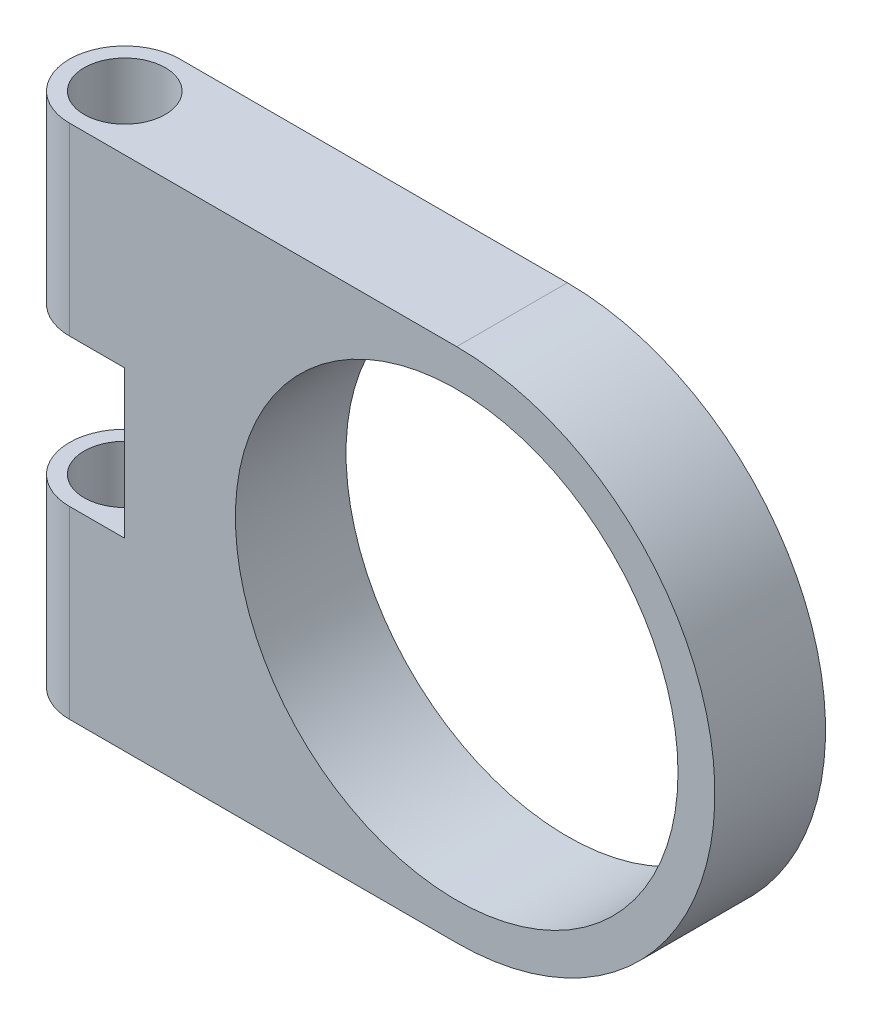
ISO-10303-21;
HEADER;
FILE_DESCRIPTION(('STEP AP214'),'2;1');
FILE_NAME('part.step','',(''),(''),'','','');
FILE_SCHEMA(('AUTOMOTIVE_DESIGN { 1 0 10303 214 1 1 1 1 }'));
ENDSEC;
DATA;
#1=APPLICATION_CONTEXT('core data for automotive mechanical design processes');
#2=APPLICATION_PROTOCOL_DEFINITION('international standard','automotive_design',2000,#1);
#3=PRODUCT_CONTEXT('',#1,'mechanical');
#4=PRODUCT('Part','Part','',(#3));
#5=PRODUCT_RELATED_PRODUCT_CATEGORY('part','',(#4));
#6=PRODUCT_DEFINITION_FORMATION('','',#4);
#7=PRODUCT_DEFINITION_CONTEXT('part definition',#1,'design');
#8=PRODUCT_DEFINITION('design','',#6,#7);
#9=PRODUCT_DEFINITION_SHAPE('','',#8);
#10=(LENGTH_UNIT() NAMED_UNIT(*) SI_UNIT(.MILLI.,.METRE.));
#11=(NAMED_UNIT(*) PLANE_ANGLE_UNIT() SI_UNIT($,.RADIAN.));
#12=(NAMED_UNIT(*) SI_UNIT($,.STERADIAN.) SOLID_ANGLE_UNIT());
#13=UNCERTAINTY_MEASURE_WITH_UNIT(LENGTH_MEASURE(1.E-05),#10,'distance_accuracy_value','');
#14=(GEOMETRIC_REPRESENTATION_CONTEXT(3) GLOBAL_UNCERTAINTY_ASSIGNED_CONTEXT((#13)) GLOBAL_UNIT_ASSIGNED_CONTEXT((#10,
#11,#12)) REPRESENTATION_CONTEXT('',''));
#15=CARTESIAN_POINT('',(0.,0.,0.));
#16=DIRECTION('',(0.,0.,1.));
#17=DIRECTION('',(1.,0.,0.));
#18=AXIS2_PLACEMENT_3D('',#15,#16,#17);
#19=CARTESIAN_POINT('',(-52.5,-35.,-7.5));
#20=DIRECTION('',(0.,-1.,0.));
#21=DIRECTION('',(1.,0.,0.));
#22=AXIS2_PLACEMENT_3D('',#19,#20,#21);
#23=CYLINDRICAL_SURFACE('',#22,7.5);
#24=DIRECTION('',(0.,1.,0.));
#25=VECTOR('',#24,1.);
#26=CARTESIAN_POINT('',(-52.5,-35.,-15.));
#27=LINE('',#26,#25);
#28=CARTESIAN_POINT('',(-52.5,-35.,-15.));
#29=VERTEX_POINT('',#28);
#30=CARTESIAN_POINT('',(-52.5,-10.,-15.));
#31=VERTEX_POINT('',#30);
#32=EDGE_CURVE('E173',#29,#31,#27,.T.);
#33=ORIENTED_EDGE('',*,*,#32,.F.);
#34=CARTESIAN_POINT('',(-52.5,-35.,-7.5));
#35=DIRECTION('',(0.,-1.,0.));
#36=DIRECTION('',(1.,0.,0.));
#37=AXIS2_PLACEMENT_3D('',#34,#35,#36);
#38=CIRCLE('',#37,7.5);
#39=CARTESIAN_POINT('',(-52.5,-35.,0.));
#40=VERTEX_POINT('',#39);
#41=EDGE_CURVE('E42',#40,#29,#38,.T.);
#42=ORIENTED_EDGE('',*,*,#41,.F.);
#43=DIRECTION('',(0.,-1.,0.));
#44=VECTOR('',#43,1.);
#45=CARTESIAN_POINT('',(-52.5,0.,0.));
#46=LINE('',#45,#44);
#47=CARTESIAN_POINT('',(-52.5,-10.,0.));
#48=VERTEX_POINT('',#47);
#49=EDGE_CURVE('E176',#48,#40,#46,.T.);
#50=ORIENTED_EDGE('',*,*,#49,.F.);
#51=CARTESIAN_POINT('',(-52.5,-10.,-7.5));
#52=DIRECTION('',(0.,1.,0.));
#53=DIRECTION('',(0.,0.,1.));
#54=AXIS2_PLACEMENT_3D('',#51,#52,#53);
#55=CIRCLE('',#54,7.5);
#56=EDGE_CURVE('E11',#31,#48,#55,.T.);
#57=ORIENTED_EDGE('',*,*,#56,.F.);
#58=EDGE_LOOP('',(#33,#42,#50,#57));
#59=FACE_BOUND('',#58,.T.);
#60=ADVANCED_FACE('F34',(#59),#23,.T.);
#61=CARTESIAN_POINT('',(-52.5,35.,-7.5));
#62=DIRECTION('',(0.,-1.,0.));
#63=DIRECTION('',(1.,0.,0.));
#64=AXIS2_PLACEMENT_3D('',#61,#62,#63);
#65=CYLINDRICAL_SURFACE('',#64,7.5);
#66=DIRECTION('',(0.,-1.,0.));
#67=VECTOR('',#66,1.);
#68=CARTESIAN_POINT('',(-52.5,0.,0.));
#69=LINE('',#68,#67);
#70=CARTESIAN_POINT('',(-52.5,35.,0.));
#71=VERTEX_POINT('',#70);
#72=CARTESIAN_POINT('',(-52.5,10.,0.));
#73=VERTEX_POINT('',#72);
#74=EDGE_CURVE('E159',#71,#73,#69,.T.);
#75=ORIENTED_EDGE('',*,*,#74,.F.);
#76=CARTESIAN_POINT('',(-52.5,35.,-7.5));
#77=DIRECTION('',(0.,1.,0.));
#78=DIRECTION('',(-1.,0.,0.));
#79=AXIS2_PLACEMENT_3D('',#76,#77,#78);
#80=CIRCLE('',#79,7.5);
#81=CARTESIAN_POINT('',(-52.5,35.,-15.));
#82=VERTEX_POINT('',#81);
#83=EDGE_CURVE('E171',#82,#71,#80,.T.);
#84=ORIENTED_EDGE('',*,*,#83,.F.);
#85=DIRECTION('',(0.,1.,0.));
#86=VECTOR('',#85,1.);
#87=CARTESIAN_POINT('',(-52.5,35.,-15.));
#88=LINE('',#87,#86);
#89=CARTESIAN_POINT('',(-52.5,10.,-15.));
#90=VERTEX_POINT('',#89);
#91=EDGE_CURVE('E168',#90,#82,#88,.T.);
#92=ORIENTED_EDGE('',*,*,#91,.F.);
#93=CARTESIAN_POINT('',(-52.5,10.,-7.5));
#94=DIRECTION('',(0.,1.,0.));
#95=DIRECTION('',(0.,0.,1.));
#96=AXIS2_PLACEMENT_3D('',#93,#94,#95);
#97=CIRCLE('',#96,7.5);
#98=EDGE_CURVE('E165',#73,#90,#97,.F.);
#99=ORIENTED_EDGE('',*,*,#98,.F.);
#100=EDGE_LOOP('',(#75,#84,#92,#99));
#101=FACE_BOUND('',#100,.T.);
#102=ADVANCED_FACE('F194',(#101),#65,.T.);
#103=CARTESIAN_POINT('',(-52.5,-50.556349186104,-7.5));
#104=DIRECTION('',(0.,1.,0.));
#105=DIRECTION('',(-1.,0.,0.));
#106=AXIS2_PLACEMENT_3D('',#103,#104,#105);
#107=CYLINDRICAL_SURFACE('',#106,5.5);
#108=CARTESIAN_POINT('',(-52.5,-35.,-7.5));
#109=DIRECTION('',(0.,-1.,0.));
#110=DIRECTION('',(1.,0.,0.));
#111=AXIS2_PLACEMENT_3D('',#108,#109,#110);
#112=CIRCLE('',#111,5.5);
#113=CARTESIAN_POINT('',(-58.,-35.,-7.5));
#114=VERTEX_POINT('',#113);
#115=EDGE_CURVE('E131',#114,#114,#112,.F.);
#116=CARTESIAN_POINT('',(-52.5,-10.,-7.5));
#117=DIRECTION('',(0.,1.,0.));
#118=DIRECTION('',(0.,0.,1.));
#119=AXIS2_PLACEMENT_3D('',#116,#117,#118);
#120=CIRCLE('',#119,5.5);
#121=CARTESIAN_POINT('',(-58.,-10.,-7.5));
#122=VERTEX_POINT('',#121);
#123=EDGE_CURVE('E119',#122,#122,#120,.F.);
#124=CARTESIAN_POINT('',(-58.,-35.,-7.5));
#125=CARTESIAN_POINT('',(-58.,-34.7395833333333,-7.5));
#126=CARTESIAN_POINT('',(-58.,-34.4791666666667,-7.5));
#127=CARTESIAN_POINT('',(-58.,-33.9583333333333,-7.5));
#128=CARTESIAN_POINT('',(-58.,-33.6979166666667,-7.5));
#129=CARTESIAN_POINT('',(-58.,-33.1770833333333,-7.5));
#130=CARTESIAN_POINT('',(-58.,-32.9166666666667,-7.5));
#131=CARTESIAN_POINT('',(-58.,-32.3958333333333,-7.5));
#132=CARTESIAN_POINT('',(-58.,-32.1354166666667,-7.5));
#133=CARTESIAN_POINT('',(-58.,-31.6145833333333,-7.5));
#134=CARTESIAN_POINT('',(-58.,-31.3541666666667,-7.5));
#135=CARTESIAN_POINT('',(-58.,-30.8333333333333,-7.5));
#136=CARTESIAN_POINT('',(-58.,-30.5729166666667,-7.5));
#137=CARTESIAN_POINT('',(-58.,-30.0520833333333,-7.5));
#138=CARTESIAN_POINT('',(-58.,-29.7916666666667,-7.5));
#139=CARTESIAN_POINT('',(-58.,-29.2708333333333,-7.5));
#140=CARTESIAN_POINT('',(-58.,-29.0104166666667,-7.5));
#141=CARTESIAN_POINT('',(-58.,-28.4895833333333,-7.5));
#142=CARTESIAN_POINT('',(-58.,-28.2291666666667,-7.5));
#143=CARTESIAN_POINT('',(-58.,-27.7083333333333,-7.5));
#144=CARTESIAN_POINT('',(-58.,-27.4479166666667,-7.5));
#145=CARTESIAN_POINT('',(-58.,-26.9270833333333,-7.5));
#146=CARTESIAN_POINT('',(-58.,-26.6666666666667,-7.5));
#147=CARTESIAN_POINT('',(-58.,-26.1458333333333,-7.5));
#148=CARTESIAN_POINT('',(-58.,-25.8854166666667,-7.5));
#149=CARTESIAN_POINT('',(-58.,-25.3645833333333,-7.5));
#150=CARTESIAN_POINT('',(-58.,-25.1041666666667,-7.5));
#151=CARTESIAN_POINT('',(-58.,-24.5833333333333,-7.5));
#152=CARTESIAN_POINT('',(-58.,-24.3229166666667,-7.5));
#153=CARTESIAN_POINT('',(-58.,-23.8020833333333,-7.5));
#154=CARTESIAN_POINT('',(-58.,-23.5416666666667,-7.5));
#155=CARTESIAN_POINT('',(-58.,-23.0208333333333,-7.5));
#156=CARTESIAN_POINT('',(-58.,-22.7604166666667,-7.5));
#157=CARTESIAN_POINT('',(-58.,-22.2395833333333,-7.5));
#158=CARTESIAN_POINT('',(-58.,-21.9791666666667,-7.5));
#159=CARTESIAN_POINT('',(-58.,-21.4583333333333,-7.5));
#160=CARTESIAN_POINT('',(-58.,-21.1979166666667,-7.5));
#161=CARTESIAN_POINT('',(-58.,-20.6770833333333,-7.5));
#162=CARTESIAN_POINT('',(-58.,-20.4166666666667,-7.5));
#163=CARTESIAN_POINT('',(-58.,-19.8958333333333,-7.5));
#164=CARTESIAN_POINT('',(-58.,-19.6354166666667,-7.5));
#165=CARTESIAN_POINT('',(-58.,-19.1145833333333,-7.5));
#166=CARTESIAN_POINT('',(-58.,-18.8541666666667,-7.5));
#167=CARTESIAN_POINT('',(-58.,-18.3333333333333,-7.5));
#168=CARTESIAN_POINT('',(-58.,-18.0729166666667,-7.5));
#169=CARTESIAN_POINT('',(-58.,-17.5520833333333,-7.5));
#170=CARTESIAN_POINT('',(-58.,-17.2916666666667,-7.5));
#171=CARTESIAN_POINT('',(-58.,-16.7708333333333,-7.5));
#172=CARTESIAN_POINT('',(-58.,-16.5104166666667,-7.5));
#173=CARTESIAN_POINT('',(-58.,-15.9895833333333,-7.5));
#174=CARTESIAN_POINT('',(-58.,-15.7291666666667,-7.5));
#175=CARTESIAN_POINT('',(-58.,-15.2083333333333,-7.5));
#176=CARTESIAN_POINT('',(-58.,-14.9479166666667,-7.5));
#177=CARTESIAN_POINT('',(-58.,-14.4270833333333,-7.5));
#178=CARTESIAN_POINT('',(-58.,-14.1666666666667,-7.5));
#179=CARTESIAN_POINT('',(-58.,-13.6458333333333,-7.5));
#180=CARTESIAN_POINT('',(-58.,-13.3854166666667,-7.5));
#181=CARTESIAN_POINT('',(-58.,-12.8645833333333,-7.5));
#182=CARTESIAN_POINT('',(-58.,-12.6041666666667,-7.5));
#183=CARTESIAN_POINT('',(-58.,-12.0833333333333,-7.5));
#184=CARTESIAN_POINT('',(-58.,-11.8229166666667,-7.5));
#185=CARTESIAN_POINT('',(-58.,-11.3020833333333,-7.5));
#186=CARTESIAN_POINT('',(-58.,-11.0416666666667,-7.5));
#187=CARTESIAN_POINT('',(-58.,-10.5208333333333,-7.5));
#188=CARTESIAN_POINT('',(-58.,-10.2604166666667,-7.5));
#189=CARTESIAN_POINT('',(-58.,-10.,-7.5));
#190=B_SPLINE_CURVE_WITH_KNOTS('',3,(#124,#125,#126,#127,#128,#129,#130,#131,#132,#133,#134,
#135,#136,#137,#138,#139,#140,#141,#142,#143,#144,#145,#146,#147,#148,#149,#150,#151,#152,#153,
#154,#155,#156,#157,#158,#159,#160,#161,#162,#163,#164,#165,#166,#167,#168,#169,#170,#171,#172,
#173,#174,#175,#176,#177,#178,#179,#180,#181,#182,#183,#184,#185,#186,#187,#188,#189),
.UNSPECIFIED.,.F.,.F.,(4,2,2,2,2,2,2,2,2,2,2,2,2,2,2,2,2,2,2,2,2,2,2,2,2,2,2,2,2,2,2,2,4),(0.,
0.781250000000004,1.5625,2.34375,3.125,3.90625,4.6875,5.46875,6.25,7.03125,7.8125,8.59375,9.375,
10.15625,10.9375,11.71875,12.5,13.28125,14.0625,14.84375,15.625,16.40625,17.1875,17.96875,18.75,
19.53125,20.3125,21.09375,21.875,22.65625,23.4375,24.21875,25.),.UNSPECIFIED.);
#191=EDGE_CURVE('BSEAM212',#114,#122,#190,.T.);
#192=ORIENTED_EDGE('',*,*,#115,.F.);
#193=ORIENTED_EDGE('',*,*,#123,.F.);
#194=ORIENTED_EDGE('',*,*,#191,.T.);
#195=ORIENTED_EDGE('',*,*,#191,.F.);
#196=EDGE_LOOP('',(#192,#194,#193,#195));
#197=FACE_BOUND('',#196,.T.);
#198=ADVANCED_FACE('F212',(#197),#107,.F.);
#199=CARTESIAN_POINT('',(-60.,35.,-15.));
#200=DIRECTION('',(0.,1.,0.));
#201=DIRECTION('',(-1.,0.,0.));
#202=AXIS2_PLACEMENT_3D('',#199,#200,#201);
#203=PLANE('',#202);
#204=CARTESIAN_POINT('',(-52.5,35.,-7.5));
#205=DIRECTION('',(0.,1.,0.));
#206=DIRECTION('',(-1.,0.,0.));
#207=AXIS2_PLACEMENT_3D('',#204,#205,#206);
#208=CIRCLE('',#207,5.5);
#209=CARTESIAN_POINT('',(-58.,35.,-7.5));
#210=VERTEX_POINT('',#209);
#211=EDGE_CURVE('E128',#210,#210,#208,.T.);
#212=ORIENTED_EDGE('',*,*,#211,.F.);
#213=EDGE_LOOP('',(#212));
#214=FACE_BOUND('',#213,.T.);
#215=DIRECTION('',(-1.,0.,0.));
#216=VECTOR('',#215,1.);
#217=CARTESIAN_POINT('',(-60.,35.,-15.));
#218=LINE('',#217,#216);
#219=CARTESIAN_POINT('',(0.,35.,-15.));
#220=VERTEX_POINT('',#219);
#221=EDGE_CURVE('E147',#220,#82,#218,.T.);
#222=ORIENTED_EDGE('',*,*,#221,.T.);
#223=ORIENTED_EDGE('',*,*,#83,.T.);
#224=DIRECTION('',(-1.,0.,0.));
#225=VECTOR('',#224,1.);
#226=CARTESIAN_POINT('',(-60.,35.,0.));
#227=LINE('',#226,#225);
#228=CARTESIAN_POINT('',(0.,35.,0.));
#229=VERTEX_POINT('',#228);
#230=EDGE_CURVE('E144',#229,#71,#227,.T.);
#231=ORIENTED_EDGE('',*,*,#230,.F.);
#232=DIRECTION('',(0.,0.,1.));
#233=VECTOR('',#232,1.);
#234=CARTESIAN_POINT('',(0.,35.,-15.));
#235=LINE('',#234,#233);
#236=EDGE_CURVE('E157',#220,#229,#235,.T.);
#237=ORIENTED_EDGE('',*,*,#236,.F.);
#238=EDGE_LOOP('',(#222,#223,#231,#237));
#239=FACE_BOUND('',#238,.T.);
#240=ADVANCED_FACE('F191',(#214,#239),#203,.T.);
#241=CARTESIAN_POINT('',(0.,0.,-15.));
#242=DIRECTION('',(0.,0.,1.));
#243=DIRECTION('',(1.,0.,0.));
#244=AXIS2_PLACEMENT_3D('',#241,#242,#243);
#245=CYLINDRICAL_SURFACE('',#244,35.);
#246=CARTESIAN_POINT('',(0.,0.,0.));
#247=DIRECTION('',(0.,0.,1.));
#248=DIRECTION('',(1.,0.,0.));
#249=AXIS2_PLACEMENT_3D('',#246,#247,#248);
#250=CIRCLE('',#249,35.);
#251=CARTESIAN_POINT('',(0.,-35.,0.));
#252=VERTEX_POINT('',#251);
#253=EDGE_CURVE('E152',#252,#229,#250,.T.);
#254=ORIENTED_EDGE('',*,*,#253,.F.);
#255=DIRECTION('',(0.,0.,1.));
#256=VECTOR('',#255,1.);
#257=CARTESIAN_POINT('',(0.,-35.,-15.));
#258=LINE('',#257,#256);
#259=CARTESIAN_POINT('',(0.,-35.,-15.));
#260=VERTEX_POINT('',#259);
#261=EDGE_CURVE('E150',#260,#252,#258,.T.);
#262=ORIENTED_EDGE('',*,*,#261,.F.);
#263=CARTESIAN_POINT('',(0.,0.,-15.));
#264=DIRECTION('',(0.,0.,1.));
#265=DIRECTION('',(1.,0.,0.));
#266=AXIS2_PLACEMENT_3D('',#263,#264,#265);
#267=CIRCLE('',#266,35.);
#268=EDGE_CURVE('E143',#260,#220,#267,.T.);
#269=ORIENTED_EDGE('',*,*,#268,.T.);
#270=ORIENTED_EDGE('',*,*,#236,.T.);
#271=EDGE_LOOP('',(#254,#262,#269,#270));
#272=FACE_BOUND('',#271,.T.);
#273=ADVANCED_FACE('F188',(#272),#245,.T.);
#274=CARTESIAN_POINT('',(-60.,-35.,-15.));
#275=DIRECTION('',(0.,-1.,0.));
#276=DIRECTION('',(1.,0.,0.));
#277=AXIS2_PLACEMENT_3D('',#274,#275,#276);
#278=PLANE('',#277);
#279=ORIENTED_EDGE('',*,*,#115,.T.);
#280=EDGE_LOOP('',(#279));
#281=FACE_BOUND('',#280,.T.);
#282=DIRECTION('',(1.,0.,0.));
#283=VECTOR('',#282,1.);
#284=CARTESIAN_POINT('',(-60.,-35.,0.));
#285=LINE('',#284,#283);
#286=EDGE_CURVE('E138',#40,#252,#285,.T.);
#287=ORIENTED_EDGE('',*,*,#286,.F.);
#288=ORIENTED_EDGE('',*,*,#41,.T.);
#289=DIRECTION('',(1.,0.,0.));
#290=VECTOR('',#289,1.);
#291=CARTESIAN_POINT('',(-60.,-35.,-15.));
#292=LINE('',#291,#290);
#293=EDGE_CURVE('E141',#29,#260,#292,.T.);
#294=ORIENTED_EDGE('',*,*,#293,.T.);
#295=ORIENTED_EDGE('',*,*,#261,.T.);
#296=EDGE_LOOP('',(#287,#288,#294,#295));
#297=FACE_BOUND('',#296,.T.);
#298=ADVANCED_FACE('F179',(#281,#297),#278,.T.);
#299=CARTESIAN_POINT('',(0.,0.,-15.));
#300=DIRECTION('',(0.,0.,1.));
#301=DIRECTION('',(1.,0.,0.));
#302=AXIS2_PLACEMENT_3D('',#299,#300,#301);
#303=PLANE('',#302);
#304=CARTESIAN_POINT('',(0.,0.,-15.));
#305=DIRECTION('',(0.,0.,1.));
#306=DIRECTION('',(1.,0.,0.));
#307=AXIS2_PLACEMENT_3D('',#304,#305,#306);
#308=CIRCLE('',#307,30.);
#309=CARTESIAN_POINT('',(30.,0.,-15.));
#310=VERTEX_POINT('',#309);
#311=EDGE_CURVE('E135',#310,#310,#308,.T.);
#312=ORIENTED_EDGE('',*,*,#311,.T.);
#313=EDGE_LOOP('',(#312));
#314=FACE_BOUND('',#313,.T.);
#315=ORIENTED_EDGE('',*,*,#293,.F.);
#316=ORIENTED_EDGE('',*,*,#32,.T.);
#317=DIRECTION('',(-1.,0.,0.));
#318=VECTOR('',#317,1.);
#319=CARTESIAN_POINT('',(-60.,-10.,-15.));
#320=LINE('',#319,#318);
#321=CARTESIAN_POINT('',(-45.,-10.,-15.));
#322=VERTEX_POINT('',#321);
#323=EDGE_CURVE('E103',#322,#31,#320,.T.);
#324=ORIENTED_EDGE('',*,*,#323,.F.);
#325=DIRECTION('',(0.,-1.,0.));
#326=VECTOR('',#325,1.);
#327=CARTESIAN_POINT('',(-45.,10.,-15.));
#328=LINE('',#327,#326);
#329=CARTESIAN_POINT('',(-45.,10.,-15.));
#330=VERTEX_POINT('',#329);
#331=EDGE_CURVE('E111',#330,#322,#328,.T.);
#332=ORIENTED_EDGE('',*,*,#331,.F.);
#333=DIRECTION('',(-1.,0.,0.));
#334=VECTOR('',#333,1.);
#335=CARTESIAN_POINT('',(-60.,10.,-15.));
#336=LINE('',#335,#334);
#337=EDGE_CURVE('E112',#330,#90,#336,.T.);
#338=ORIENTED_EDGE('',*,*,#337,.T.);
#339=ORIENTED_EDGE('',*,*,#91,.T.);
#340=ORIENTED_EDGE('',*,*,#221,.F.);
#341=ORIENTED_EDGE('',*,*,#268,.F.);
#342=EDGE_LOOP('',(#315,#316,#324,#332,#338,#339,#340,#341));
#343=FACE_BOUND('',#342,.T.);
#344=ADVANCED_FACE('F184',(#314,#343),#303,.F.);
#345=CARTESIAN_POINT('',(0.,0.,0.));
#346=DIRECTION('',(0.,0.,1.));
#347=DIRECTION('',(1.,0.,0.));
#348=AXIS2_PLACEMENT_3D('',#345,#346,#347);
#349=PLANE('',#348);
#350=DIRECTION('',(1.,0.,0.));
#351=VECTOR('',#350,1.);
#352=CARTESIAN_POINT('',(-45.,-10.,0.));
#353=LINE('',#352,#351);
#354=CARTESIAN_POINT('',(-45.,-10.,0.));
#355=VERTEX_POINT('',#354);
#356=EDGE_CURVE('E95',#48,#355,#353,.T.);
#357=ORIENTED_EDGE('',*,*,#356,.F.);
#358=ORIENTED_EDGE('',*,*,#49,.T.);
#359=ORIENTED_EDGE('',*,*,#286,.T.);
#360=ORIENTED_EDGE('',*,*,#253,.T.);
#361=ORIENTED_EDGE('',*,*,#230,.T.);
#362=ORIENTED_EDGE('',*,*,#74,.T.);
#363=DIRECTION('',(1.,0.,0.));
#364=VECTOR('',#363,1.);
#365=CARTESIAN_POINT('',(-45.,10.,0.));
#366=LINE('',#365,#364);
#367=CARTESIAN_POINT('',(-45.,10.,0.));
#368=VERTEX_POINT('',#367);
#369=EDGE_CURVE('E118',#73,#368,#366,.T.);
#370=ORIENTED_EDGE('',*,*,#369,.T.);
#371=DIRECTION('',(0.,-1.,0.));
#372=VECTOR('',#371,1.);
#373=CARTESIAN_POINT('',(-45.,10.,0.));
#374=LINE('',#373,#372);
#375=EDGE_CURVE('E108',#368,#355,#374,.T.);
#376=ORIENTED_EDGE('',*,*,#375,.T.);
#377=EDGE_LOOP('',(#357,#358,#359,#360,#361,#362,#370,#376));
#378=FACE_BOUND('',#377,.T.);
#379=CARTESIAN_POINT('',(0.,0.,0.));
#380=DIRECTION('',(0.,0.,1.));
#381=DIRECTION('',(1.,0.,0.));
#382=AXIS2_PLACEMENT_3D('',#379,#380,#381);
#383=CIRCLE('',#382,30.);
#384=CARTESIAN_POINT('',(30.,0.,0.));
#385=VERTEX_POINT('',#384);
#386=EDGE_CURVE('E134',#385,#385,#383,.T.);
#387=ORIENTED_EDGE('',*,*,#386,.F.);
#388=EDGE_LOOP('',(#387));
#389=FACE_BOUND('',#388,.T.);
#390=ADVANCED_FACE('F114',(#378,#389),#349,.T.);
#391=CARTESIAN_POINT('',(0.,0.,-15.));
#392=DIRECTION('',(0.,0.,1.));
#393=DIRECTION('',(1.,0.,0.));
#394=AXIS2_PLACEMENT_3D('',#391,#392,#393);
#395=CYLINDRICAL_SURFACE('',#394,30.);
#396=ORIENTED_EDGE('',*,*,#311,.F.);
#397=EDGE_LOOP('',(#396));
#398=FACE_BOUND('',#397,.T.);
#399=ORIENTED_EDGE('',*,*,#386,.T.);
#400=EDGE_LOOP('',(#399));
#401=FACE_BOUND('',#400,.T.);
#402=ADVANCED_FACE('F210',(#398,#401),#395,.F.);
#403=CARTESIAN_POINT('',(-52.5,10.,-7.5));
#404=DIRECTION('',(0.,1.,0.));
#405=DIRECTION('',(0.,0.,1.));
#406=AXIS2_PLACEMENT_3D('',#403,#404,#405);
#407=CIRCLE('',#406,5.5);
#408=CARTESIAN_POINT('',(-58.,9.99999999999999,-7.5));
#409=VERTEX_POINT('',#408);
#410=EDGE_CURVE('E122',#409,#409,#407,.F.);
#411=CARTESIAN_POINT('',(-58.,9.99999999999999,-7.5));
#412=CARTESIAN_POINT('',(-58.,10.2604166666667,-7.5));
#413=CARTESIAN_POINT('',(-58.,10.5208333333333,-7.5));
#414=CARTESIAN_POINT('',(-58.,11.0416666666667,-7.5));
#415=CARTESIAN_POINT('',(-58.,11.3020833333333,-7.5));
#416=CARTESIAN_POINT('',(-58.,11.8229166666667,-7.5));
#417=CARTESIAN_POINT('',(-58.,12.0833333333333,-7.5));
#418=CARTESIAN_POINT('',(-58.,12.6041666666667,-7.5));
#419=CARTESIAN_POINT('',(-58.,12.8645833333333,-7.5));
#420=CARTESIAN_POINT('',(-58.,13.3854166666667,-7.5));
#421=CARTESIAN_POINT('',(-58.,13.6458333333333,-7.5));
#422=CARTESIAN_POINT('',(-58.,14.1666666666667,-7.5));
#423=CARTESIAN_POINT('',(-58.,14.4270833333333,-7.5));
#424=CARTESIAN_POINT('',(-58.,14.9479166666667,-7.5));
#425=CARTESIAN_POINT('',(-58.,15.2083333333333,-7.5));
#426=CARTESIAN_POINT('',(-58.,15.7291666666666,-7.5));
#427=CARTESIAN_POINT('',(-58.,15.9895833333333,-7.5));
#428=CARTESIAN_POINT('',(-58.,16.5104166666666,-7.5));
#429=CARTESIAN_POINT('',(-58.,16.7708333333333,-7.5));
#430=CARTESIAN_POINT('',(-58.,17.2916666666666,-7.5));
#431=CARTESIAN_POINT('',(-58.,17.5520833333333,-7.5));
#432=CARTESIAN_POINT('',(-58.,18.0729166666667,-7.5));
#433=CARTESIAN_POINT('',(-58.,18.3333333333333,-7.5));
#434=CARTESIAN_POINT('',(-58.,18.8541666666667,-7.5));
#435=CARTESIAN_POINT('',(-58.,19.1145833333333,-7.5));
#436=CARTESIAN_POINT('',(-58.,19.6354166666666,-7.5));
#437=CARTESIAN_POINT('',(-58.,19.8958333333333,-7.5));
#438=CARTESIAN_POINT('',(-58.,20.4166666666666,-7.5));
#439=CARTESIAN_POINT('',(-58.,20.6770833333333,-7.5));
#440=CARTESIAN_POINT('',(-58.,21.1979166666666,-7.5));
#441=CARTESIAN_POINT('',(-58.,21.4583333333333,-7.5));
#442=CARTESIAN_POINT('',(-58.,21.9791666666666,-7.5));
#443=CARTESIAN_POINT('',(-58.,22.2395833333333,-7.5));
#444=CARTESIAN_POINT('',(-58.,22.7604166666667,-7.5));
#445=CARTESIAN_POINT('',(-58.,23.0208333333333,-7.5));
#446=CARTESIAN_POINT('',(-58.,23.5416666666666,-7.5));
#447=CARTESIAN_POINT('',(-58.,23.8020833333333,-7.5));
#448=CARTESIAN_POINT('',(-58.,24.3229166666666,-7.5));
#449=CARTESIAN_POINT('',(-58.,24.5833333333333,-7.5));
#450=CARTESIAN_POINT('',(-58.,25.1041666666666,-7.5));
#451=CARTESIAN_POINT('',(-58.,25.3645833333333,-7.5));
#452=CARTESIAN_POINT('',(-58.,25.8854166666666,-7.5));
#453=CARTESIAN_POINT('',(-58.,26.1458333333333,-7.5));
#454=CARTESIAN_POINT('',(-58.,26.6666666666666,-7.5));
#455=CARTESIAN_POINT('',(-58.,26.9270833333333,-7.5));
#456=CARTESIAN_POINT('',(-58.,27.4479166666666,-7.5));
#457=CARTESIAN_POINT('',(-58.,27.7083333333333,-7.5));
#458=CARTESIAN_POINT('',(-58.,28.2291666666666,-7.5));
#459=CARTESIAN_POINT('',(-58.,28.4895833333333,-7.5));
#460=CARTESIAN_POINT('',(-58.,29.0104166666666,-7.5));
#461=CARTESIAN_POINT('',(-58.,29.2708333333333,-7.5));
#462=CARTESIAN_POINT('',(-58.,29.7916666666666,-7.5));
#463=CARTESIAN_POINT('',(-58.,30.0520833333333,-7.5));
#464=CARTESIAN_POINT('',(-58.,30.5729166666666,-7.5));
#465=CARTESIAN_POINT('',(-58.,30.8333333333333,-7.5));
#466=CARTESIAN_POINT('',(-58.,31.3541666666666,-7.5));
#467=CARTESIAN_POINT('',(-58.,31.6145833333333,-7.5));
#468=CARTESIAN_POINT('',(-58.,32.1354166666666,-7.5));
#469=CARTESIAN_POINT('',(-58.,32.3958333333333,-7.5));
#470=CARTESIAN_POINT('',(-58.,32.9166666666666,-7.5));
#471=CARTESIAN_POINT('',(-58.,33.1770833333333,-7.5));
#472=CARTESIAN_POINT('',(-58.,33.6979166666666,-7.5));
#473=CARTESIAN_POINT('',(-58.,33.9583333333333,-7.5));
#474=CARTESIAN_POINT('',(-58.,34.4791666666666,-7.5));
#475=CARTESIAN_POINT('',(-58.,34.7395833333333,-7.5));
#476=CARTESIAN_POINT('',(-58.,35.,-7.5));
#477=B_SPLINE_CURVE_WITH_KNOTS('',3,(#411,#412,#413,#414,#415,#416,#417,#418,#419,#420,#421,
#422,#423,#424,#425,#426,#427,#428,#429,#430,#431,#432,#433,#434,#435,#436,#437,#438,#439,#440,
#441,#442,#443,#444,#445,#446,#447,#448,#449,#450,#451,#452,#453,#454,#455,#456,#457,#458,#459,
#460,#461,#462,#463,#464,#465,#466,#467,#468,#469,#470,#471,#472,#473,#474,#475,#476),
.UNSPECIFIED.,.F.,.F.,(4,2,2,2,2,2,2,2,2,2,2,2,2,2,2,2,2,2,2,2,2,2,2,2,2,2,2,2,2,2,2,2,4),(0.,
0.781249999999997,1.5625,2.34374999999998,3.125,3.90624999999999,4.68749999999999,
5.46874999999999,6.24999999999998,7.03124999999998,7.81249999999999,8.59374999999999,
9.37499999999999,10.15625,10.9375,11.71875,12.5,13.28125,14.0625,14.84375,15.625,16.40625,
17.1875,17.96875,18.75,19.53125,20.3125,21.09375,21.875,22.65625,23.4375,24.21875,25.),.UNSPECIFIED.);
#478=EDGE_CURVE('BSEAM204',#409,#210,#477,.T.);
#479=ORIENTED_EDGE('',*,*,#410,.T.);
#480=ORIENTED_EDGE('',*,*,#211,.T.);
#481=ORIENTED_EDGE('',*,*,#478,.T.);
#482=ORIENTED_EDGE('',*,*,#478,.F.);
#483=EDGE_LOOP('',(#479,#481,#480,#482));
#484=FACE_BOUND('',#483,.T.);
#485=ADVANCED_FACE('F204',(#484),#107,.F.);
#486=CARTESIAN_POINT('',(0.,10.,0.));
#487=DIRECTION('',(0.,1.,0.));
#488=DIRECTION('',(0.,0.,1.));
#489=AXIS2_PLACEMENT_3D('',#486,#487,#488);
#490=PLANE('',#489);
#491=ORIENTED_EDGE('',*,*,#369,.F.);
#492=ORIENTED_EDGE('',*,*,#98,.T.);
#493=ORIENTED_EDGE('',*,*,#337,.F.);
#494=DIRECTION('',(0.,0.,-1.));
#495=VECTOR('',#494,1.);
#496=CARTESIAN_POINT('',(-45.,10.,0.));
#497=LINE('',#496,#495);
#498=EDGE_CURVE('E124',#368,#330,#497,.T.);
#499=ORIENTED_EDGE('',*,*,#498,.F.);
#500=EDGE_LOOP('',(#491,#492,#493,#499));
#501=FACE_BOUND('',#500,.T.);
#502=ORIENTED_EDGE('',*,*,#410,.F.);
#503=EDGE_LOOP('',(#502));
#504=FACE_BOUND('',#503,.T.);
#505=ADVANCED_FACE('F196',(#501,#504),#490,.F.);
#506=CARTESIAN_POINT('',(0.,-10.,0.));
#507=DIRECTION('',(0.,1.,0.));
#508=DIRECTION('',(0.,0.,1.));
#509=AXIS2_PLACEMENT_3D('',#506,#507,#508);
#510=PLANE('',#509);
#511=ORIENTED_EDGE('',*,*,#323,.T.);
#512=ORIENTED_EDGE('',*,*,#56,.T.);
#513=ORIENTED_EDGE('',*,*,#356,.T.);
#514=DIRECTION('',(0.,0.,-1.));
#515=VECTOR('',#514,1.);
#516=CARTESIAN_POINT('',(-45.,-10.,0.));
#517=LINE('',#516,#515);
#518=EDGE_CURVE('E99',#355,#322,#517,.T.);
#519=ORIENTED_EDGE('',*,*,#518,.T.);
#520=EDGE_LOOP('',(#511,#512,#513,#519));
#521=FACE_BOUND('',#520,.T.);
#522=ORIENTED_EDGE('',*,*,#123,.T.);
#523=EDGE_LOOP('',(#522));
#524=FACE_BOUND('',#523,.T.);
#525=ADVANCED_FACE('F97',(#521,#524),#510,.T.);
#526=CARTESIAN_POINT('',(-45.,10.,0.));
#527=DIRECTION('',(-1.,0.,0.));
#528=DIRECTION('',(0.,0.,1.));
#529=AXIS2_PLACEMENT_3D('',#526,#527,#528);
#530=PLANE('',#529);
#531=ORIENTED_EDGE('',*,*,#375,.F.);
#532=ORIENTED_EDGE('',*,*,#498,.T.);
#533=ORIENTED_EDGE('',*,*,#331,.T.);
#534=ORIENTED_EDGE('',*,*,#518,.F.);
#535=EDGE_LOOP('',(#531,#532,#533,#534));
#536=FACE_BOUND('',#535,.T.);
#537=ADVANCED_FACE('F107',(#536),#530,.T.);
#538=CLOSED_SHELL('',(#60,#102,#198,#240,#273,#298,#344,#390,#402,#485,#505,#525,#537));
#539=MANIFOLD_SOLID_BREP('B2',#538);
#540=ADVANCED_BREP_SHAPE_REPRESENTATION('',(#18,#539),#14);
#541=SHAPE_DEFINITION_REPRESENTATION(#9,#540);
ENDSEC;
END-ISO-10303-21;
